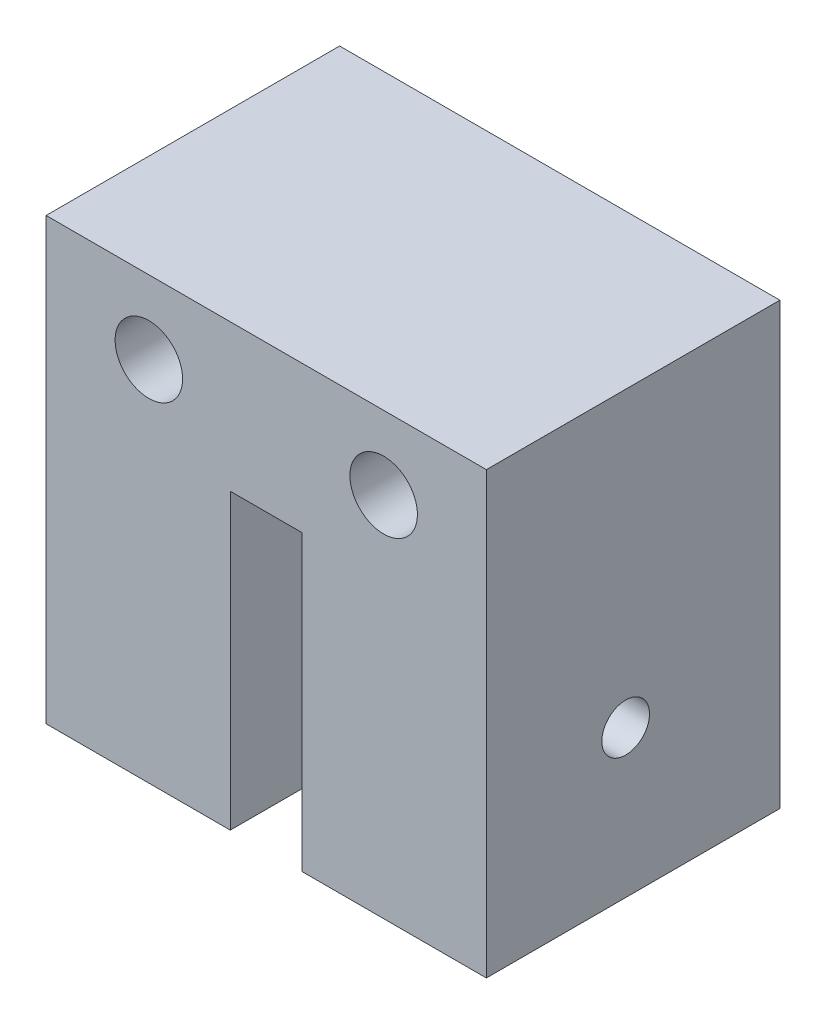
ISO-10303-21;
HEADER;
FILE_DESCRIPTION(('STEP AP214'),'2;1');
FILE_NAME('part.step','',(''),(''),'','','');
FILE_SCHEMA(('AUTOMOTIVE_DESIGN { 1 0 10303 214 1 1 1 1 }'));
ENDSEC;
DATA;
#1=APPLICATION_CONTEXT('core data for automotive mechanical design processes');
#2=APPLICATION_PROTOCOL_DEFINITION('international standard','automotive_design',2000,#1);
#3=PRODUCT_CONTEXT('',#1,'mechanical');
#4=PRODUCT('Part','Part','',(#3));
#5=PRODUCT_RELATED_PRODUCT_CATEGORY('part','',(#4));
#6=PRODUCT_DEFINITION_FORMATION('','',#4);
#7=PRODUCT_DEFINITION_CONTEXT('part definition',#1,'design');
#8=PRODUCT_DEFINITION('design','',#6,#7);
#9=PRODUCT_DEFINITION_SHAPE('','',#8);
#10=(LENGTH_UNIT() NAMED_UNIT(*) SI_UNIT(.MILLI.,.METRE.));
#11=(NAMED_UNIT(*) PLANE_ANGLE_UNIT() SI_UNIT($,.RADIAN.));
#12=(NAMED_UNIT(*) SI_UNIT($,.STERADIAN.) SOLID_ANGLE_UNIT());
#13=UNCERTAINTY_MEASURE_WITH_UNIT(LENGTH_MEASURE(1.E-05),#10,'distance_accuracy_value','');
#14=(GEOMETRIC_REPRESENTATION_CONTEXT(3) GLOBAL_UNCERTAINTY_ASSIGNED_CONTEXT((#13)) GLOBAL_UNIT_ASSIGNED_CONTEXT((#10,
#11,#12)) REPRESENTATION_CONTEXT('',''));
#15=CARTESIAN_POINT('',(0.,0.,0.));
#16=DIRECTION('',(0.,0.,1.));
#17=DIRECTION('',(1.,0.,0.));
#18=AXIS2_PLACEMENT_3D('',#15,#16,#17);
#19=CARTESIAN_POINT('',(15.,10.,10.));
#20=DIRECTION('',(-1.,0.,0.));
#21=DIRECTION('',(0.,0.,1.));
#22=AXIS2_PLACEMENT_3D('',#19,#20,#21);
#23=PLANE('',#22);
#24=CARTESIAN_POINT('',(15.,-9.96597788340986,0.508890088071548));
#25=DIRECTION('',(-1.,0.,0.));
#26=DIRECTION('',(0.,0.,1.));
#27=AXIS2_PLACEMENT_3D('',#24,#25,#26);
#28=CIRCLE('',#27,1.625);
#29=CARTESIAN_POINT('',(15.,-9.96597788340986,2.13389008807155));
#30=VERTEX_POINT('',#29);
#31=EDGE_CURVE('E220',#30,#30,#28,.T.);
#32=ORIENTED_EDGE('',*,*,#31,.T.);
#33=EDGE_LOOP('',(#32));
#34=FACE_BOUND('',#33,.T.);
#35=DIRECTION('',(0.,-1.,0.));
#36=VECTOR('',#35,1.);
#37=CARTESIAN_POINT('',(15.,10.,10.));
#38=LINE('',#37,#36);
#39=CARTESIAN_POINT('',(15.,10.,10.));
#40=VERTEX_POINT('',#39);
#41=CARTESIAN_POINT('',(15.,-20.,10.));
#42=VERTEX_POINT('',#41);
#43=EDGE_CURVE('E175',#40,#42,#38,.T.);
#44=ORIENTED_EDGE('',*,*,#43,.T.);
#45=DIRECTION('',(0.,0.,1.));
#46=VECTOR('',#45,1.);
#47=CARTESIAN_POINT('',(15.,-20.,0.));
#48=LINE('',#47,#46);
#49=CARTESIAN_POINT('',(15.,-20.,-10.));
#50=VERTEX_POINT('',#49);
#51=EDGE_CURVE('E146',#50,#42,#48,.T.);
#52=ORIENTED_EDGE('',*,*,#51,.F.);
#53=DIRECTION('',(0.,-1.,0.));
#54=VECTOR('',#53,1.);
#55=CARTESIAN_POINT('',(15.,10.,-10.));
#56=LINE('',#55,#54);
#57=CARTESIAN_POINT('',(15.,10.,-10.));
#58=VERTEX_POINT('',#57);
#59=EDGE_CURVE('E11',#58,#50,#56,.T.);
#60=ORIENTED_EDGE('',*,*,#59,.F.);
#61=DIRECTION('',(0.,0.,-1.));
#62=VECTOR('',#61,1.);
#63=CARTESIAN_POINT('',(15.,10.,10.));
#64=LINE('',#63,#62);
#65=EDGE_CURVE('E152',#40,#58,#64,.T.);
#66=ORIENTED_EDGE('',*,*,#65,.F.);
#67=EDGE_LOOP('',(#44,#52,#60,#66));
#68=FACE_BOUND('',#67,.T.);
#69=ADVANCED_FACE('F37',(#34,#68),#23,.F.);
#70=CARTESIAN_POINT('',(-15.,10.,-10.));
#71=DIRECTION('',(0.,0.,1.));
#72=DIRECTION('',(1.,0.,0.));
#73=AXIS2_PLACEMENT_3D('',#70,#71,#72);
#74=PLANE('',#73);
#75=CARTESIAN_POINT('',(8.,5.,-10.));
#76=DIRECTION('',(0.,0.,-1.));
#77=DIRECTION('',(-1.,0.,0.));
#78=AXIS2_PLACEMENT_3D('',#75,#76,#77);
#79=CIRCLE('',#78,2.3);
#80=CARTESIAN_POINT('',(5.7,5.,-10.));
#81=VERTEX_POINT('',#80);
#82=EDGE_CURVE('E230',#81,#81,#79,.T.);
#83=ORIENTED_EDGE('',*,*,#82,.F.);
#84=EDGE_LOOP('',(#83));
#85=FACE_BOUND('',#84,.T.);
#86=CARTESIAN_POINT('',(-8.,5.,-10.));
#87=DIRECTION('',(0.,0.,-1.));
#88=DIRECTION('',(-1.,0.,0.));
#89=AXIS2_PLACEMENT_3D('',#86,#87,#88);
#90=CIRCLE('',#89,2.3);
#91=CARTESIAN_POINT('',(-10.3,5.,-10.));
#92=VERTEX_POINT('',#91);
#93=EDGE_CURVE('E132',#92,#92,#90,.T.);
#94=ORIENTED_EDGE('',*,*,#93,.F.);
#95=EDGE_LOOP('',(#94));
#96=FACE_BOUND('',#95,.T.);
#97=ORIENTED_EDGE('',*,*,#59,.T.);
#98=DIRECTION('',(1.,0.,0.));
#99=VECTOR('',#98,1.);
#100=CARTESIAN_POINT('',(0.,-20.,-10.));
#101=LINE('',#100,#99);
#102=CARTESIAN_POINT('',(2.45,-20.,-10.));
#103=VERTEX_POINT('',#102);
#104=EDGE_CURVE('E143',#103,#50,#101,.T.);
#105=ORIENTED_EDGE('',*,*,#104,.F.);
#106=DIRECTION('',(0.,1.,0.));
#107=VECTOR('',#106,1.);
#108=CARTESIAN_POINT('',(2.45,-20.,-10.));
#109=LINE('',#108,#107);
#110=CARTESIAN_POINT('',(2.45,0.,-10.));
#111=VERTEX_POINT('',#110);
#112=EDGE_CURVE('E149',#103,#111,#109,.T.);
#113=ORIENTED_EDGE('',*,*,#112,.T.);
#114=DIRECTION('',(-1.,0.,0.));
#115=VECTOR('',#114,1.);
#116=CARTESIAN_POINT('',(-15.,0.,-10.));
#117=LINE('',#116,#115);
#118=CARTESIAN_POINT('',(-2.45,0.,-10.));
#119=VERTEX_POINT('',#118);
#120=EDGE_CURVE('E158',#111,#119,#117,.T.);
#121=ORIENTED_EDGE('',*,*,#120,.T.);
#122=DIRECTION('',(0.,1.,0.));
#123=VECTOR('',#122,1.);
#124=CARTESIAN_POINT('',(-2.45,-20.,-10.));
#125=LINE('',#124,#123);
#126=CARTESIAN_POINT('',(-2.45,-20.,-10.));
#127=VERTEX_POINT('',#126);
#128=EDGE_CURVE('E112',#127,#119,#125,.T.);
#129=ORIENTED_EDGE('',*,*,#128,.F.);
#130=DIRECTION('',(1.,0.,0.));
#131=VECTOR('',#130,1.);
#132=CARTESIAN_POINT('',(0.,-20.,-10.));
#133=LINE('',#132,#131);
#134=CARTESIAN_POINT('',(-15.,-20.,-10.));
#135=VERTEX_POINT('',#134);
#136=EDGE_CURVE('E126',#135,#127,#133,.T.);
#137=ORIENTED_EDGE('',*,*,#136,.F.);
#138=DIRECTION('',(0.,-1.,0.));
#139=VECTOR('',#138,1.);
#140=CARTESIAN_POINT('',(-15.,10.,-10.));
#141=LINE('',#140,#139);
#142=CARTESIAN_POINT('',(-15.,10.,-10.));
#143=VERTEX_POINT('',#142);
#144=EDGE_CURVE('E45',#143,#135,#141,.T.);
#145=ORIENTED_EDGE('',*,*,#144,.F.);
#146=DIRECTION('',(-1.,0.,0.));
#147=VECTOR('',#146,1.);
#148=CARTESIAN_POINT('',(-15.,10.,-10.));
#149=LINE('',#148,#147);
#150=EDGE_CURVE('E199',#58,#143,#149,.T.);
#151=ORIENTED_EDGE('',*,*,#150,.F.);
#152=EDGE_LOOP('',(#97,#105,#113,#121,#129,#137,#145,#151));
#153=FACE_BOUND('',#152,.T.);
#154=ADVANCED_FACE('F184',(#85,#96,#153),#74,.F.);
#155=CARTESIAN_POINT('',(-15.,10.,10.));
#156=DIRECTION('',(1.,0.,0.));
#157=DIRECTION('',(0.,0.,-1.));
#158=AXIS2_PLACEMENT_3D('',#155,#156,#157);
#159=PLANE('',#158);
#160=CARTESIAN_POINT('',(-15.,-9.96597788340986,0.508890088071548));
#161=DIRECTION('',(-1.,0.,0.));
#162=DIRECTION('',(0.,0.,1.));
#163=AXIS2_PLACEMENT_3D('',#160,#161,#162);
#164=CIRCLE('',#163,1.625);
#165=CARTESIAN_POINT('',(-15.,-9.96597788340986,2.13389008807155));
#166=VERTEX_POINT('',#165);
#167=EDGE_CURVE('E222',#166,#166,#164,.T.);
#168=ORIENTED_EDGE('',*,*,#167,.F.);
#169=EDGE_LOOP('',(#168));
#170=FACE_BOUND('',#169,.T.);
#171=ORIENTED_EDGE('',*,*,#144,.T.);
#172=DIRECTION('',(0.,0.,-1.));
#173=VECTOR('',#172,1.);
#174=CARTESIAN_POINT('',(-15.,-20.,0.));
#175=LINE('',#174,#173);
#176=CARTESIAN_POINT('',(-15.,-20.,10.));
#177=VERTEX_POINT('',#176);
#178=EDGE_CURVE('E122',#177,#135,#175,.T.);
#179=ORIENTED_EDGE('',*,*,#178,.F.);
#180=DIRECTION('',(0.,-1.,0.));
#181=VECTOR('',#180,1.);
#182=CARTESIAN_POINT('',(-15.,10.,10.));
#183=LINE('',#182,#181);
#184=CARTESIAN_POINT('',(-15.,10.,10.));
#185=VERTEX_POINT('',#184);
#186=EDGE_CURVE('E118',#185,#177,#183,.T.);
#187=ORIENTED_EDGE('',*,*,#186,.F.);
#188=DIRECTION('',(0.,0.,1.));
#189=VECTOR('',#188,1.);
#190=CARTESIAN_POINT('',(-15.,10.,10.));
#191=LINE('',#190,#189);
#192=EDGE_CURVE('E182',#143,#185,#191,.T.);
#193=ORIENTED_EDGE('',*,*,#192,.F.);
#194=EDGE_LOOP('',(#171,#179,#187,#193));
#195=FACE_BOUND('',#194,.T.);
#196=ADVANCED_FACE('F181',(#170,#195),#159,.F.);
#197=CARTESIAN_POINT('',(-15.,10.,10.));
#198=DIRECTION('',(0.,0.,-1.));
#199=DIRECTION('',(-1.,0.,0.));
#200=AXIS2_PLACEMENT_3D('',#197,#198,#199);
#201=PLANE('',#200);
#202=CARTESIAN_POINT('',(8.,5.,10.));
#203=DIRECTION('',(0.,0.,-1.));
#204=DIRECTION('',(-1.,0.,0.));
#205=AXIS2_PLACEMENT_3D('',#202,#203,#204);
#206=CIRCLE('',#205,2.3);
#207=CARTESIAN_POINT('',(5.7,5.,10.));
#208=VERTEX_POINT('',#207);
#209=EDGE_CURVE('E232',#208,#208,#206,.T.);
#210=ORIENTED_EDGE('',*,*,#209,.T.);
#211=EDGE_LOOP('',(#210));
#212=FACE_BOUND('',#211,.T.);
#213=CARTESIAN_POINT('',(-8.,5.,10.));
#214=DIRECTION('',(0.,0.,-1.));
#215=DIRECTION('',(-1.,0.,0.));
#216=AXIS2_PLACEMENT_3D('',#213,#214,#215);
#217=CIRCLE('',#216,2.3);
#218=CARTESIAN_POINT('',(-10.3,5.,10.));
#219=VERTEX_POINT('',#218);
#220=EDGE_CURVE('E129',#219,#219,#217,.T.);
#221=ORIENTED_EDGE('',*,*,#220,.T.);
#222=EDGE_LOOP('',(#221));
#223=FACE_BOUND('',#222,.T.);
#224=ORIENTED_EDGE('',*,*,#186,.T.);
#225=DIRECTION('',(-1.,0.,0.));
#226=VECTOR('',#225,1.);
#227=CARTESIAN_POINT('',(0.,-20.,10.));
#228=LINE('',#227,#226);
#229=CARTESIAN_POINT('',(-2.45,-20.,10.));
#230=VERTEX_POINT('',#229);
#231=EDGE_CURVE('E115',#230,#177,#228,.T.);
#232=ORIENTED_EDGE('',*,*,#231,.F.);
#233=DIRECTION('',(0.,1.,0.));
#234=VECTOR('',#233,1.);
#235=CARTESIAN_POINT('',(-2.45,-20.,10.));
#236=LINE('',#235,#234);
#237=CARTESIAN_POINT('',(-2.45,0.,10.));
#238=VERTEX_POINT('',#237);
#239=EDGE_CURVE('E104',#230,#238,#236,.T.);
#240=ORIENTED_EDGE('',*,*,#239,.T.);
#241=DIRECTION('',(1.,0.,0.));
#242=VECTOR('',#241,1.);
#243=CARTESIAN_POINT('',(-15.,0.,10.));
#244=LINE('',#243,#242);
#245=CARTESIAN_POINT('',(2.45,0.,10.));
#246=VERTEX_POINT('',#245);
#247=EDGE_CURVE('E53',#238,#246,#244,.T.);
#248=ORIENTED_EDGE('',*,*,#247,.T.);
#249=DIRECTION('',(0.,1.,0.));
#250=VECTOR('',#249,1.);
#251=CARTESIAN_POINT('',(2.45,-20.,10.));
#252=LINE('',#251,#250);
#253=CARTESIAN_POINT('',(2.45,-20.,10.));
#254=VERTEX_POINT('',#253);
#255=EDGE_CURVE('E162',#254,#246,#252,.T.);
#256=ORIENTED_EDGE('',*,*,#255,.F.);
#257=DIRECTION('',(-1.,0.,0.));
#258=VECTOR('',#257,1.);
#259=CARTESIAN_POINT('',(0.,-20.,10.));
#260=LINE('',#259,#258);
#261=EDGE_CURVE('E138',#42,#254,#260,.T.);
#262=ORIENTED_EDGE('',*,*,#261,.F.);
#263=ORIENTED_EDGE('',*,*,#43,.F.);
#264=DIRECTION('',(1.,0.,0.));
#265=VECTOR('',#264,1.);
#266=CARTESIAN_POINT('',(-15.,10.,10.));
#267=LINE('',#266,#265);
#268=EDGE_CURVE('E61',#185,#40,#267,.T.);
#269=ORIENTED_EDGE('',*,*,#268,.F.);
#270=EDGE_LOOP('',(#224,#232,#240,#248,#256,#262,#263,#269));
#271=FACE_BOUND('',#270,.T.);
#272=ADVANCED_FACE('F116',(#212,#223,#271),#201,.F.);
#273=CARTESIAN_POINT('',(0.,10.,0.));
#274=DIRECTION('',(0.,-1.,0.));
#275=DIRECTION('',(0.,0.,-1.));
#276=AXIS2_PLACEMENT_3D('',#273,#274,#275);
#277=PLANE('',#276);
#278=ORIENTED_EDGE('',*,*,#65,.T.);
#279=ORIENTED_EDGE('',*,*,#150,.T.);
#280=ORIENTED_EDGE('',*,*,#192,.T.);
#281=ORIENTED_EDGE('',*,*,#268,.T.);
#282=EDGE_LOOP('',(#278,#279,#280,#281));
#283=FACE_BOUND('',#282,.T.);
#284=ADVANCED_FACE('F201',(#283),#277,.F.);
#285=CARTESIAN_POINT('',(0.,0.,0.));
#286=DIRECTION('',(0.,-1.,0.));
#287=DIRECTION('',(0.,0.,-1.));
#288=AXIS2_PLACEMENT_3D('',#285,#286,#287);
#289=PLANE('',#288);
#290=DIRECTION('',(0.,0.,-1.));
#291=VECTOR('',#290,1.);
#292=CARTESIAN_POINT('',(-2.45,0.,0.));
#293=LINE('',#292,#291);
#294=EDGE_CURVE('E110',#238,#119,#293,.T.);
#295=ORIENTED_EDGE('',*,*,#294,.T.);
#296=ORIENTED_EDGE('',*,*,#120,.F.);
#297=DIRECTION('',(0.,0.,-1.));
#298=VECTOR('',#297,1.);
#299=CARTESIAN_POINT('',(2.45,0.,0.));
#300=LINE('',#299,#298);
#301=EDGE_CURVE('E111',#246,#111,#300,.T.);
#302=ORIENTED_EDGE('',*,*,#301,.F.);
#303=ORIENTED_EDGE('',*,*,#247,.F.);
#304=EDGE_LOOP('',(#295,#296,#302,#303));
#305=FACE_BOUND('',#304,.T.);
#306=ADVANCED_FACE('F187',(#305),#289,.T.);
#307=CARTESIAN_POINT('',(2.45,-20.,0.));
#308=DIRECTION('',(1.,0.,0.));
#309=DIRECTION('',(0.,0.,-1.));
#310=AXIS2_PLACEMENT_3D('',#307,#308,#309);
#311=PLANE('',#310);
#312=CARTESIAN_POINT('',(2.45,-9.96597788340986,0.508890088071548));
#313=DIRECTION('',(1.,0.,0.));
#314=DIRECTION('',(0.,0.,-1.));
#315=AXIS2_PLACEMENT_3D('',#312,#313,#314);
#316=CIRCLE('',#315,1.625);
#317=CARTESIAN_POINT('',(2.45,-9.96597788340986,-1.11610991192846));
#318=VERTEX_POINT('',#317);
#319=EDGE_CURVE('E225',#318,#318,#316,.T.);
#320=ORIENTED_EDGE('',*,*,#319,.T.);
#321=EDGE_LOOP('',(#320));
#322=FACE_BOUND('',#321,.T.);
#323=ORIENTED_EDGE('',*,*,#301,.T.);
#324=ORIENTED_EDGE('',*,*,#112,.F.);
#325=DIRECTION('',(0.,0.,-1.));
#326=VECTOR('',#325,1.);
#327=CARTESIAN_POINT('',(2.45,-20.,0.));
#328=LINE('',#327,#326);
#329=EDGE_CURVE('E141',#254,#103,#328,.T.);
#330=ORIENTED_EDGE('',*,*,#329,.F.);
#331=ORIENTED_EDGE('',*,*,#255,.T.);
#332=EDGE_LOOP('',(#323,#324,#330,#331));
#333=FACE_BOUND('',#332,.T.);
#334=ADVANCED_FACE('F190',(#322,#333),#311,.F.);
#335=CARTESIAN_POINT('',(0.,-20.,0.));
#336=DIRECTION('',(0.,-1.,0.));
#337=DIRECTION('',(0.,0.,-1.));
#338=AXIS2_PLACEMENT_3D('',#335,#336,#337);
#339=PLANE('',#338);
#340=ORIENTED_EDGE('',*,*,#261,.T.);
#341=ORIENTED_EDGE('',*,*,#329,.T.);
#342=ORIENTED_EDGE('',*,*,#104,.T.);
#343=ORIENTED_EDGE('',*,*,#51,.T.);
#344=EDGE_LOOP('',(#340,#341,#342,#343));
#345=FACE_BOUND('',#344,.T.);
#346=ADVANCED_FACE('F194',(#345),#339,.T.);
#347=CARTESIAN_POINT('',(-2.45,-20.,0.));
#348=DIRECTION('',(1.,0.,0.));
#349=DIRECTION('',(0.,0.,-1.));
#350=AXIS2_PLACEMENT_3D('',#347,#348,#349);
#351=PLANE('',#350);
#352=CARTESIAN_POINT('',(-2.45,-9.96597788340986,0.508890088071548));
#353=DIRECTION('',(1.,0.,0.));
#354=DIRECTION('',(0.,0.,-1.));
#355=AXIS2_PLACEMENT_3D('',#352,#353,#354);
#356=CIRCLE('',#355,1.625);
#357=CARTESIAN_POINT('',(-2.45,-9.96597788340986,-1.11610991192846));
#358=VERTEX_POINT('',#357);
#359=EDGE_CURVE('E40',#358,#358,#356,.T.);
#360=ORIENTED_EDGE('',*,*,#359,.F.);
#361=EDGE_LOOP('',(#360));
#362=FACE_BOUND('',#361,.T.);
#363=ORIENTED_EDGE('',*,*,#294,.F.);
#364=ORIENTED_EDGE('',*,*,#239,.F.);
#365=DIRECTION('',(0.,0.,-1.));
#366=VECTOR('',#365,1.);
#367=CARTESIAN_POINT('',(-2.45,-20.,0.));
#368=LINE('',#367,#366);
#369=EDGE_CURVE('E108',#230,#127,#368,.T.);
#370=ORIENTED_EDGE('',*,*,#369,.T.);
#371=ORIENTED_EDGE('',*,*,#128,.T.);
#372=EDGE_LOOP('',(#363,#364,#370,#371));
#373=FACE_BOUND('',#372,.T.);
#374=ADVANCED_FACE('F106',(#362,#373),#351,.T.);
#375=CARTESIAN_POINT('',(0.,-20.,0.));
#376=DIRECTION('',(0.,-1.,0.));
#377=DIRECTION('',(0.,0.,-1.));
#378=AXIS2_PLACEMENT_3D('',#375,#376,#377);
#379=PLANE('',#378);
#380=ORIENTED_EDGE('',*,*,#369,.F.);
#381=ORIENTED_EDGE('',*,*,#231,.T.);
#382=ORIENTED_EDGE('',*,*,#178,.T.);
#383=ORIENTED_EDGE('',*,*,#136,.T.);
#384=EDGE_LOOP('',(#380,#381,#382,#383));
#385=FACE_BOUND('',#384,.T.);
#386=ADVANCED_FACE('F124',(#385),#379,.T.);
#387=CARTESIAN_POINT('',(-8.,5.,10.00005));
#388=DIRECTION('',(0.,0.,-1.));
#389=DIRECTION('',(-1.,0.,0.));
#390=AXIS2_PLACEMENT_3D('',#387,#388,#389);
#391=CYLINDRICAL_SURFACE('',#390,2.3);
#392=ORIENTED_EDGE('',*,*,#93,.T.);
#393=EDGE_LOOP('',(#392));
#394=FACE_BOUND('',#393,.T.);
#395=ORIENTED_EDGE('',*,*,#220,.F.);
#396=EDGE_LOOP('',(#395));
#397=FACE_BOUND('',#396,.T.);
#398=ADVANCED_FACE('F244',(#394,#397),#391,.F.);
#399=CARTESIAN_POINT('',(8.,5.,10.00005));
#400=DIRECTION('',(0.,0.,-1.));
#401=DIRECTION('',(-1.,0.,0.));
#402=AXIS2_PLACEMENT_3D('',#399,#400,#401);
#403=CYLINDRICAL_SURFACE('',#402,2.3);
#404=ORIENTED_EDGE('',*,*,#82,.T.);
#405=EDGE_LOOP('',(#404));
#406=FACE_BOUND('',#405,.T.);
#407=ORIENTED_EDGE('',*,*,#209,.F.);
#408=EDGE_LOOP('',(#407));
#409=FACE_BOUND('',#408,.T.);
#410=ADVANCED_FACE('F246',(#406,#409),#403,.F.);
#411=CARTESIAN_POINT('',(15.,-9.96597788340986,0.508890088071548));
#412=DIRECTION('',(-1.,0.,0.));
#413=DIRECTION('',(0.,0.,1.));
#414=AXIS2_PLACEMENT_3D('',#411,#412,#413);
#415=CYLINDRICAL_SURFACE('',#414,1.625);
#416=ORIENTED_EDGE('',*,*,#359,.T.);
#417=EDGE_LOOP('',(#416));
#418=FACE_BOUND('',#417,.T.);
#419=ORIENTED_EDGE('',*,*,#167,.T.);
#420=EDGE_LOOP('',(#419));
#421=FACE_BOUND('',#420,.T.);
#422=ADVANCED_FACE('F252',(#418,#421),#415,.F.);
#423=ORIENTED_EDGE('',*,*,#31,.F.);
#424=EDGE_LOOP('',(#423));
#425=FACE_BOUND('',#424,.T.);
#426=ORIENTED_EDGE('',*,*,#319,.F.);
#427=EDGE_LOOP('',(#426));
#428=FACE_BOUND('',#427,.T.);
#429=ADVANCED_FACE('F267',(#425,#428),#415,.F.);
#430=CLOSED_SHELL('',(#69,#154,#196,#272,#284,#306,#334,#346,#374,#386,#398,#410,#422,#429));
#431=MANIFOLD_SOLID_BREP('B2',#430);
#432=ADVANCED_BREP_SHAPE_REPRESENTATION('',(#18,#431),#14);
#433=SHAPE_DEFINITION_REPRESENTATION(#9,#432);
ENDSEC;
END-ISO-10303-21;
